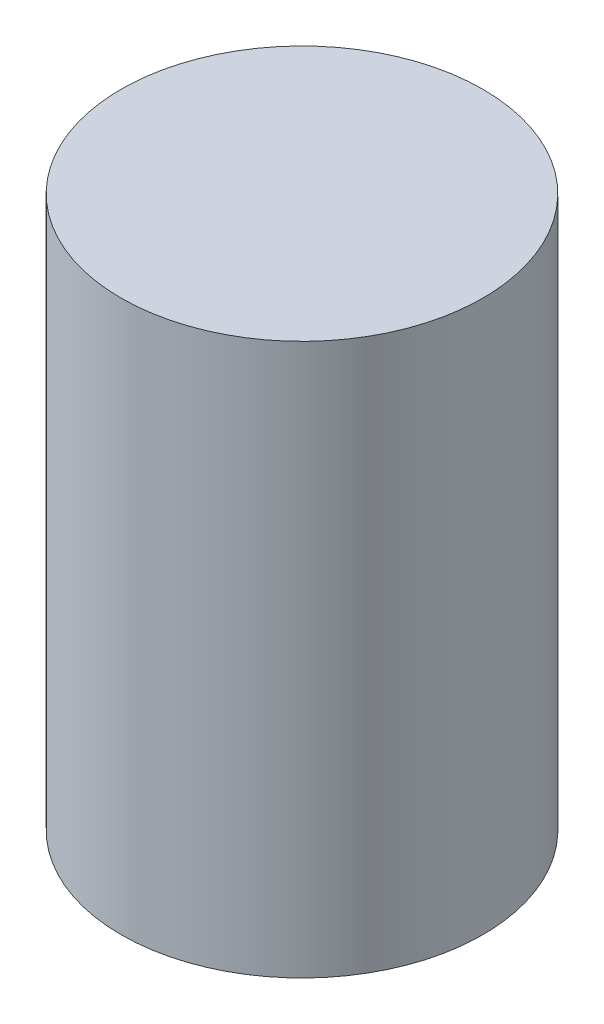
ISO-10303-21;
HEADER;
FILE_DESCRIPTION(('STEP AP214'),'2;1');
FILE_NAME('part.step','',(''),(''),'','','');
FILE_SCHEMA(('AUTOMOTIVE_DESIGN { 1 0 10303 214 1 1 1 1 }'));
ENDSEC;
DATA;
#1=APPLICATION_CONTEXT('core data for automotive mechanical design processes');
#2=APPLICATION_PROTOCOL_DEFINITION('international standard','automotive_design',2000,#1);
#3=PRODUCT_CONTEXT('',#1,'mechanical');
#4=PRODUCT('Part','Part','',(#3));
#5=PRODUCT_RELATED_PRODUCT_CATEGORY('part','',(#4));
#6=PRODUCT_DEFINITION_FORMATION('','',#4);
#7=PRODUCT_DEFINITION_CONTEXT('part definition',#1,'design');
#8=PRODUCT_DEFINITION('design','',#6,#7);
#9=PRODUCT_DEFINITION_SHAPE('','',#8);
#10=(LENGTH_UNIT() NAMED_UNIT(*) SI_UNIT(.MILLI.,.METRE.));
#11=(NAMED_UNIT(*) PLANE_ANGLE_UNIT() SI_UNIT($,.RADIAN.));
#12=(NAMED_UNIT(*) SI_UNIT($,.STERADIAN.) SOLID_ANGLE_UNIT());
#13=UNCERTAINTY_MEASURE_WITH_UNIT(LENGTH_MEASURE(1.E-05),#10,'distance_accuracy_value','');
#14=(GEOMETRIC_REPRESENTATION_CONTEXT(3) GLOBAL_UNCERTAINTY_ASSIGNED_CONTEXT((#13)) GLOBAL_UNIT_ASSIGNED_CONTEXT((#10,
#11,#12)) REPRESENTATION_CONTEXT('',''));
#15=CARTESIAN_POINT('',(0.,0.,0.));
#16=DIRECTION('',(0.,0.,1.));
#17=DIRECTION('',(1.,0.,0.));
#18=AXIS2_PLACEMENT_3D('',#15,#16,#17);
#19=CARTESIAN_POINT('',(0.,19.05,0.));
#20=DIRECTION('',(0.,-1.,0.));
#21=DIRECTION('',(0.,0.,-1.));
#22=AXIS2_PLACEMENT_3D('',#19,#20,#21);
#23=CYLINDRICAL_SURFACE('',#22,6.25);
#24=CARTESIAN_POINT('',(0.,19.05,0.));
#25=DIRECTION('',(0.,1.,0.));
#26=DIRECTION('',(0.,0.,1.));
#27=AXIS2_PLACEMENT_3D('',#24,#25,#26);
#28=CIRCLE('',#27,6.25);
#29=CARTESIAN_POINT('',(0.,19.05,-6.25));
#30=VERTEX_POINT('',#29);
#31=EDGE_CURVE('E10',#30,#30,#28,.T.);
#32=CARTESIAN_POINT('',(0.,0.,0.));
#33=DIRECTION('',(0.,1.,0.));
#34=DIRECTION('',(0.,0.,1.));
#35=AXIS2_PLACEMENT_3D('',#32,#33,#34);
#36=CIRCLE('',#35,6.25);
#37=CARTESIAN_POINT('',(0.,0.,-6.25));
#38=VERTEX_POINT('',#37);
#39=EDGE_CURVE('E40',#38,#38,#36,.T.);
#40=CARTESIAN_POINT('',(0.,19.05,-6.25));
#41=CARTESIAN_POINT('',(0.,18.8515625,-6.25));
#42=CARTESIAN_POINT('',(0.,18.653125,-6.25));
#43=CARTESIAN_POINT('',(0.,18.25625,-6.25));
#44=CARTESIAN_POINT('',(0.,18.0578125,-6.25));
#45=CARTESIAN_POINT('',(0.,17.6609375,-6.25));
#46=CARTESIAN_POINT('',(0.,17.4625,-6.25));
#47=CARTESIAN_POINT('',(0.,17.065625,-6.25));
#48=CARTESIAN_POINT('',(0.,16.8671875,-6.25));
#49=CARTESIAN_POINT('',(0.,16.4703125,-6.25));
#50=CARTESIAN_POINT('',(0.,16.271875,-6.25));
#51=CARTESIAN_POINT('',(0.,15.875,-6.25));
#52=CARTESIAN_POINT('',(0.,15.6765625,-6.25));
#53=CARTESIAN_POINT('',(0.,15.2796875,-6.25));
#54=CARTESIAN_POINT('',(0.,15.08125,-6.25));
#55=CARTESIAN_POINT('',(0.,14.684375,-6.25));
#56=CARTESIAN_POINT('',(0.,14.4859375,-6.25));
#57=CARTESIAN_POINT('',(0.,14.0890625,-6.25));
#58=CARTESIAN_POINT('',(0.,13.890625,-6.25));
#59=CARTESIAN_POINT('',(0.,13.49375,-6.25));
#60=CARTESIAN_POINT('',(0.,13.2953125,-6.25));
#61=CARTESIAN_POINT('',(0.,12.8984375,-6.25));
#62=CARTESIAN_POINT('',(0.,12.7,-6.25));
#63=CARTESIAN_POINT('',(0.,12.303125,-6.25));
#64=CARTESIAN_POINT('',(0.,12.1046875,-6.25));
#65=CARTESIAN_POINT('',(0.,11.7078125,-6.25));
#66=CARTESIAN_POINT('',(0.,11.509375,-6.25));
#67=CARTESIAN_POINT('',(0.,11.1125,-6.25));
#68=CARTESIAN_POINT('',(0.,10.9140625,-6.25));
#69=CARTESIAN_POINT('',(0.,10.5171875,-6.25));
#70=CARTESIAN_POINT('',(0.,10.31875,-6.25));
#71=CARTESIAN_POINT('',(0.,9.921875,-6.25));
#72=CARTESIAN_POINT('',(0.,9.7234375,-6.25));
#73=CARTESIAN_POINT('',(0.,9.3265625,-6.25));
#74=CARTESIAN_POINT('',(0.,9.128125,-6.25));
#75=CARTESIAN_POINT('',(0.,8.73125,-6.25));
#76=CARTESIAN_POINT('',(0.,8.5328125,-6.25));
#77=CARTESIAN_POINT('',(0.,8.1359375,-6.25));
#78=CARTESIAN_POINT('',(0.,7.9375,-6.25));
#79=CARTESIAN_POINT('',(0.,7.540625,-6.25));
#80=CARTESIAN_POINT('',(0.,7.3421875,-6.25));
#81=CARTESIAN_POINT('',(0.,6.9453125,-6.25));
#82=CARTESIAN_POINT('',(0.,6.746875,-6.25));
#83=CARTESIAN_POINT('',(0.,6.35,-6.25));
#84=CARTESIAN_POINT('',(0.,6.1515625,-6.25));
#85=CARTESIAN_POINT('',(0.,5.7546875,-6.25));
#86=CARTESIAN_POINT('',(0.,5.55625,-6.25));
#87=CARTESIAN_POINT('',(0.,5.159375,-6.25));
#88=CARTESIAN_POINT('',(0.,4.9609375,-6.25));
#89=CARTESIAN_POINT('',(0.,4.5640625,-6.25));
#90=CARTESIAN_POINT('',(0.,4.365625,-6.25));
#91=CARTESIAN_POINT('',(0.,3.96875,-6.25));
#92=CARTESIAN_POINT('',(0.,3.7703125,-6.25));
#93=CARTESIAN_POINT('',(0.,3.3734375,-6.25));
#94=CARTESIAN_POINT('',(0.,3.175,-6.25));
#95=CARTESIAN_POINT('',(0.,2.778125,-6.25));
#96=CARTESIAN_POINT('',(0.,2.5796875,-6.25));
#97=CARTESIAN_POINT('',(0.,2.1828125,-6.25));
#98=CARTESIAN_POINT('',(0.,1.984375,-6.25));
#99=CARTESIAN_POINT('',(0.,1.5875,-6.25));
#100=CARTESIAN_POINT('',(0.,1.3890625,-6.25));
#101=CARTESIAN_POINT('',(0.,0.992187500000001,-6.25));
#102=CARTESIAN_POINT('',(0.,0.793750000000001,-6.25));
#103=CARTESIAN_POINT('',(0.,0.396875,-6.25));
#104=CARTESIAN_POINT('',(0.,0.1984375,-6.25));
#105=CARTESIAN_POINT('',(0.,0.,-6.25));
#106=B_SPLINE_CURVE_WITH_KNOTS('',3,(#40,#41,#42,#43,#44,#45,#46,#47,#48,#49,#50,#51,#52,#53,
#54,#55,#56,#57,#58,#59,#60,#61,#62,#63,#64,#65,#66,#67,#68,#69,#70,#71,#72,#73,#74,#75,#76,#77,
#78,#79,#80,#81,#82,#83,#84,#85,#86,#87,#88,#89,#90,#91,#92,#93,#94,#95,#96,#97,#98,#99,#100,
#101,#102,#103,#104,#105),.UNSPECIFIED.,.F.,.F.,(4,2,2,2,2,2,2,2,2,2,2,2,2,2,2,2,2,2,2,2,2,2,2,
2,2,2,2,2,2,2,2,2,4),(0.,0.5953125,1.190625,1.7859375,2.38125,2.9765625,3.571875,4.1671875,
4.7625,5.3578125,5.953125,6.5484375,7.14375,7.7390625,8.334375,8.9296875,9.525,10.1203125,
10.715625,11.3109375,11.90625,12.5015625,13.096875,13.6921875,14.2875,14.8828125,15.478125,
16.0734375,16.66875,17.2640625,17.859375,18.4546875,19.05),.UNSPECIFIED.);
#107=EDGE_CURVE('BSEAM37',#30,#38,#106,.T.);
#108=ORIENTED_EDGE('',*,*,#31,.F.);
#109=ORIENTED_EDGE('',*,*,#39,.T.);
#110=ORIENTED_EDGE('',*,*,#107,.T.);
#111=ORIENTED_EDGE('',*,*,#107,.F.);
#112=EDGE_LOOP('',(#108,#110,#109,#111));
#113=FACE_BOUND('',#112,.T.);
#114=ADVANCED_FACE('F37',(#113),#23,.T.);
#115=CARTESIAN_POINT('',(0.,19.05,0.));
#116=DIRECTION('',(0.,1.,0.));
#117=DIRECTION('',(0.,0.,1.));
#118=AXIS2_PLACEMENT_3D('',#115,#116,#117);
#119=PLANE('',#118);
#120=ORIENTED_EDGE('',*,*,#31,.T.);
#121=EDGE_LOOP('',(#120));
#122=FACE_BOUND('',#121,.T.);
#123=ADVANCED_FACE('F52',(#122),#119,.T.);
#124=CARTESIAN_POINT('',(0.,0.,0.));
#125=DIRECTION('',(0.,1.,0.));
#126=DIRECTION('',(0.,0.,1.));
#127=AXIS2_PLACEMENT_3D('',#124,#125,#126);
#128=PLANE('',#127);
#129=ORIENTED_EDGE('',*,*,#39,.F.);
#130=EDGE_LOOP('',(#129));
#131=FACE_BOUND('',#130,.T.);
#132=ADVANCED_FACE('F50',(#131),#128,.F.);
#133=CLOSED_SHELL('',(#114,#123,#132));
#134=MANIFOLD_SOLID_BREP('B2',#133);
#135=ADVANCED_BREP_SHAPE_REPRESENTATION('',(#18,#134),#14);
#136=SHAPE_DEFINITION_REPRESENTATION(#9,#135);
ENDSEC;
END-ISO-10303-21;
